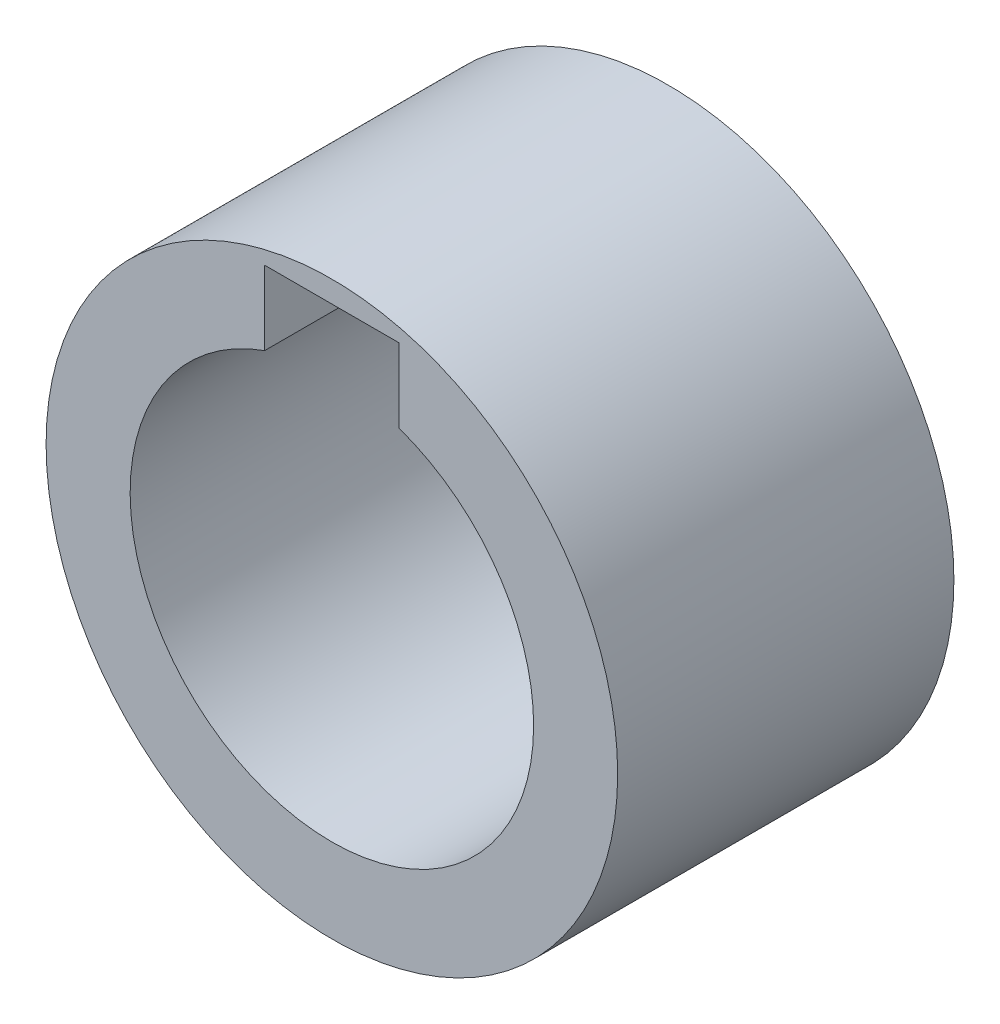
ISO-10303-21;
HEADER;
FILE_DESCRIPTION(('STEP AP214'),'2;1');
FILE_NAME('part.step','',(''),(''),'','','');
FILE_SCHEMA(('AUTOMOTIVE_DESIGN { 1 0 10303 214 1 1 1 1 }'));
ENDSEC;
DATA;
#1=APPLICATION_CONTEXT('core data for automotive mechanical design processes');
#2=APPLICATION_PROTOCOL_DEFINITION('international standard','automotive_design',2000,#1);
#3=PRODUCT_CONTEXT('',#1,'mechanical');
#4=PRODUCT('Part','Part','',(#3));
#5=PRODUCT_RELATED_PRODUCT_CATEGORY('part','',(#4));
#6=PRODUCT_DEFINITION_FORMATION('','',#4);
#7=PRODUCT_DEFINITION_CONTEXT('part definition',#1,'design');
#8=PRODUCT_DEFINITION('design','',#6,#7);
#9=PRODUCT_DEFINITION_SHAPE('','',#8);
#10=(LENGTH_UNIT() NAMED_UNIT(*) SI_UNIT(.MILLI.,.METRE.));
#11=(NAMED_UNIT(*) PLANE_ANGLE_UNIT() SI_UNIT($,.RADIAN.));
#12=(NAMED_UNIT(*) SI_UNIT($,.STERADIAN.) SOLID_ANGLE_UNIT());
#13=UNCERTAINTY_MEASURE_WITH_UNIT(LENGTH_MEASURE(1.E-05),#10,'distance_accuracy_value','');
#14=(GEOMETRIC_REPRESENTATION_CONTEXT(3) GLOBAL_UNCERTAINTY_ASSIGNED_CONTEXT((#13)) GLOBAL_UNIT_ASSIGNED_CONTEXT((#10,
#11,#12)) REPRESENTATION_CONTEXT('',''));
#15=CARTESIAN_POINT('',(0.,0.,0.));
#16=DIRECTION('',(0.,0.,1.));
#17=DIRECTION('',(1.,0.,0.));
#18=AXIS2_PLACEMENT_3D('',#15,#16,#17);
#19=CARTESIAN_POINT('',(0.,0.,-4.16532063939494));
#20=DIRECTION('',(0.,0.,1.));
#21=DIRECTION('',(1.,0.,0.));
#22=AXIS2_PLACEMENT_3D('',#19,#20,#21);
#23=CYLINDRICAL_SURFACE('',#22,3.);
#24=CARTESIAN_POINT('',(0.,0.,10.));
#25=DIRECTION('',(0.,0.,1.));
#26=DIRECTION('',(1.,0.,0.));
#27=AXIS2_PLACEMENT_3D('',#24,#25,#26);
#28=CIRCLE('',#27,3.);
#29=CARTESIAN_POINT('',(0.999999999999999,2.82842712474619,10.));
#30=VERTEX_POINT('',#29);
#31=CARTESIAN_POINT('',(-1.,2.82842712474619,10.));
#32=VERTEX_POINT('',#31);
#33=EDGE_CURVE('E115',#30,#32,#28,.F.);
#34=ORIENTED_EDGE('',*,*,#33,.F.);
#35=DIRECTION('',(0.,0.,1.));
#36=VECTOR('',#35,1.);
#37=CARTESIAN_POINT('',(1.,2.82842712474619,-4.16532063939494));
#38=LINE('',#37,#36);
#39=CARTESIAN_POINT('',(1.,2.82842712474619,5.));
#40=VERTEX_POINT('',#39);
#41=EDGE_CURVE('E94',#40,#30,#38,.T.);
#42=ORIENTED_EDGE('',*,*,#41,.F.);
#43=CARTESIAN_POINT('',(0.,0.,5.));
#44=DIRECTION('',(0.,0.,1.));
#45=DIRECTION('',(1.,0.,0.));
#46=AXIS2_PLACEMENT_3D('',#43,#44,#45);
#47=CIRCLE('',#46,3.);
#48=CARTESIAN_POINT('',(-1.,2.82842712474619,5.));
#49=VERTEX_POINT('',#48);
#50=EDGE_CURVE('E116',#40,#49,#47,.F.);
#51=ORIENTED_EDGE('',*,*,#50,.T.);
#52=DIRECTION('',(0.,0.,1.));
#53=VECTOR('',#52,1.);
#54=CARTESIAN_POINT('',(-1.,2.82842712474619,-4.16532063939494));
#55=LINE('',#54,#53);
#56=EDGE_CURVE('E108',#49,#32,#55,.T.);
#57=ORIENTED_EDGE('',*,*,#56,.T.);
#58=EDGE_LOOP('',(#34,#42,#51,#57));
#59=FACE_BOUND('',#58,.T.);
#60=ADVANCED_FACE('F44',(#59),#23,.F.);
#61=CARTESIAN_POINT('',(-1.,3.92842712474619,-4.16532063939494));
#62=DIRECTION('',(-1.,0.,0.));
#63=DIRECTION('',(0.,-1.,0.));
#64=AXIS2_PLACEMENT_3D('',#61,#62,#63);
#65=PLANE('',#64);
#66=DIRECTION('',(0.,1.,0.));
#67=VECTOR('',#66,1.);
#68=CARTESIAN_POINT('',(-1.,3.92842712474619,10.));
#69=LINE('',#68,#67);
#70=CARTESIAN_POINT('',(-1.,3.92842712474619,10.));
#71=VERTEX_POINT('',#70);
#72=EDGE_CURVE('E60',#32,#71,#69,.T.);
#73=ORIENTED_EDGE('',*,*,#72,.F.);
#74=ORIENTED_EDGE('',*,*,#56,.F.);
#75=DIRECTION('',(0.,1.,0.));
#76=VECTOR('',#75,1.);
#77=CARTESIAN_POINT('',(-1.,3.92842712474619,5.));
#78=LINE('',#77,#76);
#79=CARTESIAN_POINT('',(-1.,3.92842712474619,5.));
#80=VERTEX_POINT('',#79);
#81=EDGE_CURVE('E106',#49,#80,#78,.T.);
#82=ORIENTED_EDGE('',*,*,#81,.T.);
#83=DIRECTION('',(0.,0.,1.));
#84=VECTOR('',#83,1.);
#85=CARTESIAN_POINT('',(-1.,3.92842712474619,-4.16532063939494));
#86=LINE('',#85,#84);
#87=EDGE_CURVE('E102',#80,#71,#86,.T.);
#88=ORIENTED_EDGE('',*,*,#87,.T.);
#89=EDGE_LOOP('',(#73,#74,#82,#88));
#90=FACE_BOUND('',#89,.T.);
#91=ADVANCED_FACE('F133',(#90),#65,.F.);
#92=CARTESIAN_POINT('',(0.,0.,11.));
#93=DIRECTION('',(0.,0.,-1.));
#94=DIRECTION('',(-1.,0.,0.));
#95=AXIS2_PLACEMENT_3D('',#92,#93,#94);
#96=CYLINDRICAL_SURFACE('',#95,4.25);
#97=CARTESIAN_POINT('',(0.,0.,5.));
#98=DIRECTION('',(0.,0.,1.));
#99=DIRECTION('',(1.,0.,0.));
#100=AXIS2_PLACEMENT_3D('',#97,#98,#99);
#101=CIRCLE('',#100,4.25);
#102=CARTESIAN_POINT('',(4.25,0.,5.));
#103=VERTEX_POINT('',#102);
#104=EDGE_CURVE('E119',#103,#103,#101,.T.);
#105=ORIENTED_EDGE('',*,*,#104,.T.);
#106=EDGE_LOOP('',(#105));
#107=FACE_BOUND('',#106,.T.);
#108=CARTESIAN_POINT('',(0.,0.,10.));
#109=DIRECTION('',(0.,0.,1.));
#110=DIRECTION('',(1.,0.,0.));
#111=AXIS2_PLACEMENT_3D('',#108,#109,#110);
#112=CIRCLE('',#111,4.25);
#113=CARTESIAN_POINT('',(4.25,0.,10.));
#114=VERTEX_POINT('',#113);
#115=EDGE_CURVE('E96',#114,#114,#112,.T.);
#116=ORIENTED_EDGE('',*,*,#115,.F.);
#117=EDGE_LOOP('',(#116));
#118=FACE_BOUND('',#117,.T.);
#119=ADVANCED_FACE('F144',(#107,#118),#96,.T.);
#120=CARTESIAN_POINT('',(0.999999999999999,3.92842712474619,-4.16532063939494));
#121=DIRECTION('',(-1.,0.,0.));
#122=DIRECTION('',(0.,-1.,0.));
#123=AXIS2_PLACEMENT_3D('',#120,#121,#122);
#124=PLANE('',#123);
#125=ORIENTED_EDGE('',*,*,#41,.T.);
#126=DIRECTION('',(0.,1.,0.));
#127=VECTOR('',#126,1.);
#128=CARTESIAN_POINT('',(0.999999999999999,3.92842712474619,10.));
#129=LINE('',#128,#127);
#130=CARTESIAN_POINT('',(0.999999999999999,3.92842712474619,10.));
#131=VERTEX_POINT('',#130);
#132=EDGE_CURVE('E85',#30,#131,#129,.T.);
#133=ORIENTED_EDGE('',*,*,#132,.T.);
#134=DIRECTION('',(0.,0.,1.));
#135=VECTOR('',#134,1.);
#136=CARTESIAN_POINT('',(0.999999999999999,3.92842712474619,-4.16532063939494));
#137=LINE('',#136,#135);
#138=CARTESIAN_POINT('',(0.999999999999999,3.92842712474619,5.));
#139=VERTEX_POINT('',#138);
#140=EDGE_CURVE('E92',#139,#131,#137,.T.);
#141=ORIENTED_EDGE('',*,*,#140,.F.);
#142=DIRECTION('',(0.,1.,0.));
#143=VECTOR('',#142,1.);
#144=CARTESIAN_POINT('',(0.999999999999999,3.92842712474619,5.));
#145=LINE('',#144,#143);
#146=EDGE_CURVE('E53',#40,#139,#145,.T.);
#147=ORIENTED_EDGE('',*,*,#146,.F.);
#148=EDGE_LOOP('',(#125,#133,#141,#147));
#149=FACE_BOUND('',#148,.T.);
#150=ADVANCED_FACE('F91',(#149),#124,.T.);
#151=CARTESIAN_POINT('',(-1.,3.92842712474619,-4.16532063939494));
#152=DIRECTION('',(0.,-1.,0.));
#153=DIRECTION('',(0.,0.,-1.));
#154=AXIS2_PLACEMENT_3D('',#151,#152,#153);
#155=PLANE('',#154);
#156=ORIENTED_EDGE('',*,*,#140,.T.);
#157=DIRECTION('',(-1.,0.,0.));
#158=VECTOR('',#157,1.);
#159=CARTESIAN_POINT('',(-1.,3.92842712474619,10.));
#160=LINE('',#159,#158);
#161=EDGE_CURVE('E11',#131,#71,#160,.T.);
#162=ORIENTED_EDGE('',*,*,#161,.T.);
#163=ORIENTED_EDGE('',*,*,#87,.F.);
#164=DIRECTION('',(-1.,0.,0.));
#165=VECTOR('',#164,1.);
#166=CARTESIAN_POINT('',(-1.,3.92842712474619,5.));
#167=LINE('',#166,#165);
#168=EDGE_CURVE('E100',#139,#80,#167,.T.);
#169=ORIENTED_EDGE('',*,*,#168,.F.);
#170=EDGE_LOOP('',(#156,#162,#163,#169));
#171=FACE_BOUND('',#170,.T.);
#172=ADVANCED_FACE('F98',(#171),#155,.T.);
#173=CARTESIAN_POINT('',(10.,0.,5.));
#174=DIRECTION('',(0.,0.,1.));
#175=DIRECTION('',(1.,0.,0.));
#176=AXIS2_PLACEMENT_3D('',#173,#174,#175);
#177=PLANE('',#176);
#178=ORIENTED_EDGE('',*,*,#104,.F.);
#179=EDGE_LOOP('',(#178));
#180=FACE_BOUND('',#179,.T.);
#181=ORIENTED_EDGE('',*,*,#50,.F.);
#182=ORIENTED_EDGE('',*,*,#146,.T.);
#183=ORIENTED_EDGE('',*,*,#168,.T.);
#184=ORIENTED_EDGE('',*,*,#81,.F.);
#185=EDGE_LOOP('',(#181,#182,#183,#184));
#186=FACE_BOUND('',#185,.T.);
#187=ADVANCED_FACE('F46',(#180,#186),#177,.F.);
#188=CARTESIAN_POINT('',(0.,0.,10.));
#189=DIRECTION('',(0.,0.,1.));
#190=DIRECTION('',(1.,0.,0.));
#191=AXIS2_PLACEMENT_3D('',#188,#189,#190);
#192=PLANE('',#191);
#193=ORIENTED_EDGE('',*,*,#115,.T.);
#194=EDGE_LOOP('',(#193));
#195=FACE_BOUND('',#194,.T.);
#196=ORIENTED_EDGE('',*,*,#33,.T.);
#197=ORIENTED_EDGE('',*,*,#72,.T.);
#198=ORIENTED_EDGE('',*,*,#161,.F.);
#199=ORIENTED_EDGE('',*,*,#132,.F.);
#200=EDGE_LOOP('',(#196,#197,#198,#199));
#201=FACE_BOUND('',#200,.T.);
#202=ADVANCED_FACE('F84',(#195,#201),#192,.T.);
#203=CLOSED_SHELL('',(#60,#91,#119,#150,#172,#187,#202));
#204=MANIFOLD_SOLID_BREP('B2',#203);
#205=ADVANCED_BREP_SHAPE_REPRESENTATION('',(#18,#204),#14);
#206=SHAPE_DEFINITION_REPRESENTATION(#9,#205);
ENDSEC;
END-ISO-10303-21;
